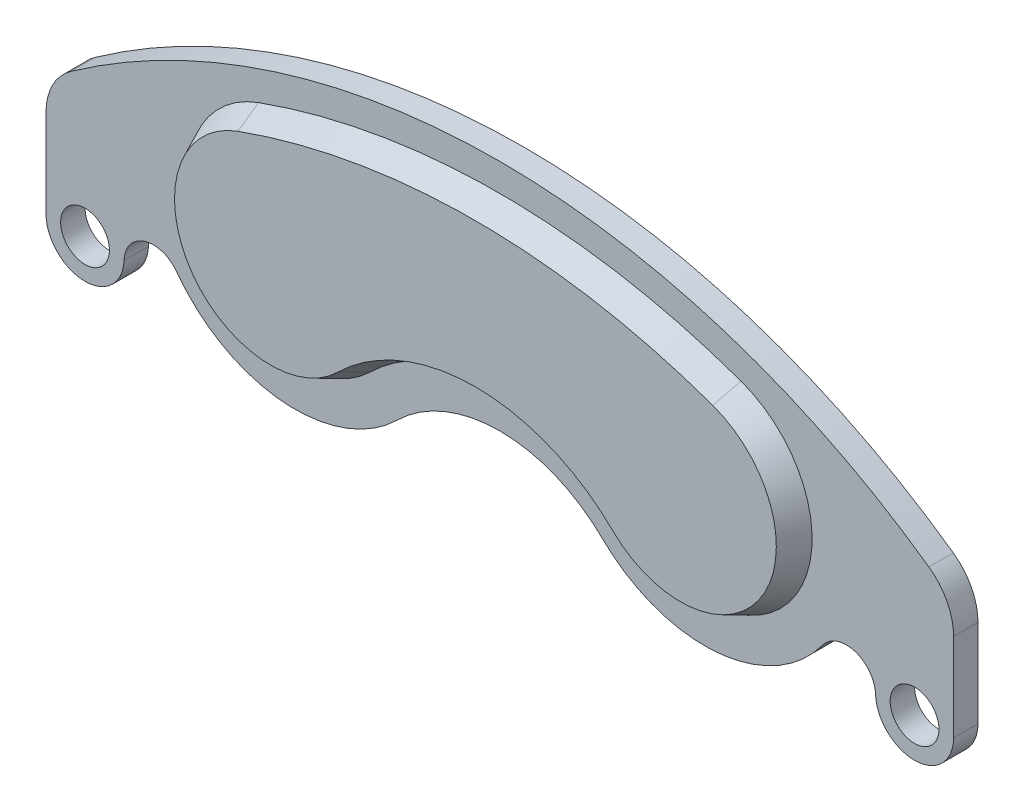
ISO-10303-21;
HEADER;
FILE_DESCRIPTION(('STEP AP214'),'2;1');
FILE_NAME('part.step','',(''),(''),'','','');
FILE_SCHEMA(('AUTOMOTIVE_DESIGN { 1 0 10303 214 1 1 1 1 }'));
ENDSEC;
DATA;
#1=APPLICATION_CONTEXT('core data for automotive mechanical design processes');
#2=APPLICATION_PROTOCOL_DEFINITION('international standard','automotive_design',2000,#1);
#3=PRODUCT_CONTEXT('',#1,'mechanical');
#4=PRODUCT('Part','Part','',(#3));
#5=PRODUCT_RELATED_PRODUCT_CATEGORY('part','',(#4));
#6=PRODUCT_DEFINITION_FORMATION('','',#4);
#7=PRODUCT_DEFINITION_CONTEXT('part definition',#1,'design');
#8=PRODUCT_DEFINITION('design','',#6,#7);
#9=PRODUCT_DEFINITION_SHAPE('','',#8);
#10=(LENGTH_UNIT() NAMED_UNIT(*) SI_UNIT(.MILLI.,.METRE.));
#11=(NAMED_UNIT(*) PLANE_ANGLE_UNIT() SI_UNIT($,.RADIAN.));
#12=(NAMED_UNIT(*) SI_UNIT($,.STERADIAN.) SOLID_ANGLE_UNIT());
#13=UNCERTAINTY_MEASURE_WITH_UNIT(LENGTH_MEASURE(1.E-05),#10,'distance_accuracy_value','');
#14=(GEOMETRIC_REPRESENTATION_CONTEXT(3) GLOBAL_UNCERTAINTY_ASSIGNED_CONTEXT((#13)) GLOBAL_UNIT_ASSIGNED_CONTEXT((#10,
#11,#12)) REPRESENTATION_CONTEXT('',''));
#15=CARTESIAN_POINT('',(0.,0.,0.));
#16=DIRECTION('',(0.,0.,1.));
#17=DIRECTION('',(1.,0.,0.));
#18=AXIS2_PLACEMENT_3D('',#15,#16,#17);
#19=CARTESIAN_POINT('',(-42.5,48.094220372994,2.5));
#20=DIRECTION('',(0.,0.,-1.));
#21=DIRECTION('',(-1.,0.,0.));
#22=AXIS2_PLACEMENT_3D('',#19,#20,#21);
#23=CYLINDRICAL_SURFACE('',#22,4.);
#24=CARTESIAN_POINT('',(-42.5,48.094220372994,0.));
#25=DIRECTION('',(0.,0.,1.));
#26=DIRECTION('',(1.,0.,0.));
#27=AXIS2_PLACEMENT_3D('',#24,#25,#26);
#28=CIRCLE('',#27,4.);
#29=CARTESIAN_POINT('',(-46.5,48.094220372994,0.));
#30=VERTEX_POINT('',#29);
#31=CARTESIAN_POINT('',(-38.5026206430965,47.9494506351267,0.));
#32=VERTEX_POINT('',#31);
#33=EDGE_CURVE('E187',#30,#32,#28,.T.);
#34=ORIENTED_EDGE('',*,*,#33,.T.);
#35=DIRECTION('',(0.,0.,-1.));
#36=VECTOR('',#35,1.);
#37=CARTESIAN_POINT('',(-38.5026206430965,47.9494506351267,2.5));
#38=LINE('',#37,#36);
#39=CARTESIAN_POINT('',(-38.5026206430965,47.9494506351267,2.5));
#40=VERTEX_POINT('',#39);
#41=EDGE_CURVE('E11',#40,#32,#38,.T.);
#42=ORIENTED_EDGE('',*,*,#41,.F.);
#43=CARTESIAN_POINT('',(-42.5,48.094220372994,2.5));
#44=DIRECTION('',(0.,0.,1.));
#45=DIRECTION('',(1.,0.,0.));
#46=AXIS2_PLACEMENT_3D('',#43,#44,#45);
#47=CIRCLE('',#46,4.);
#48=CARTESIAN_POINT('',(-46.5,48.094220372994,2.5));
#49=VERTEX_POINT('',#48);
#50=EDGE_CURVE('E223',#49,#40,#47,.T.);
#51=ORIENTED_EDGE('',*,*,#50,.F.);
#52=DIRECTION('',(0.,0.,-1.));
#53=VECTOR('',#52,1.);
#54=CARTESIAN_POINT('',(-46.5,48.094220372994,2.5));
#55=LINE('',#54,#53);
#56=EDGE_CURVE('E183',#49,#30,#55,.T.);
#57=ORIENTED_EDGE('',*,*,#56,.T.);
#58=EDGE_LOOP('',(#34,#42,#51,#57));
#59=FACE_BOUND('',#58,.T.);
#60=ADVANCED_FACE('F51',(#59),#23,.T.);
#61=CARTESIAN_POINT('',(-35.504586125419,47.8408733317263,2.5));
#62=DIRECTION('',(0.,0.,-1.));
#63=DIRECTION('',(-1.,0.,0.));
#64=AXIS2_PLACEMENT_3D('',#61,#62,#63);
#65=CYLINDRICAL_SURFACE('',#64,3.);
#66=CARTESIAN_POINT('',(-35.504586125419,47.8408733317263,0.));
#67=DIRECTION('',(0.,0.,-1.));
#68=DIRECTION('',(-1.,0.,0.));
#69=AXIS2_PLACEMENT_3D('',#66,#67,#68);
#70=CIRCLE('',#69,3.);
#71=CARTESIAN_POINT('',(-33.0871551045158,49.6173944431053,0.));
#72=VERTEX_POINT('',#71);
#73=EDGE_CURVE('E191',#32,#72,#70,.T.);
#74=ORIENTED_EDGE('',*,*,#73,.T.);
#75=DIRECTION('',(0.,0.,-1.));
#76=VECTOR('',#75,1.);
#77=CARTESIAN_POINT('',(-33.0871551045158,49.6173944431053,2.5));
#78=LINE('',#77,#76);
#79=CARTESIAN_POINT('',(-33.0871551045158,49.6173944431053,2.5));
#80=VERTEX_POINT('',#79);
#81=EDGE_CURVE('E59',#80,#72,#78,.T.);
#82=ORIENTED_EDGE('',*,*,#81,.F.);
#83=CARTESIAN_POINT('',(-35.504586125419,47.8408733317263,2.5));
#84=DIRECTION('',(0.,0.,-1.));
#85=DIRECTION('',(-1.,0.,0.));
#86=AXIS2_PLACEMENT_3D('',#83,#84,#85);
#87=CIRCLE('',#86,3.);
#88=EDGE_CURVE('E128',#40,#80,#87,.T.);
#89=ORIENTED_EDGE('',*,*,#88,.F.);
#90=ORIENTED_EDGE('',*,*,#41,.T.);
#91=EDGE_LOOP('',(#74,#82,#89,#90));
#92=FACE_BOUND('',#91,.T.);
#93=ADVANCED_FACE('F428',(#92),#65,.F.);
#94=CARTESIAN_POINT('',(-21.,58.5,2.5));
#95=DIRECTION('',(0.,0.,-1.));
#96=DIRECTION('',(-1.,0.,0.));
#97=AXIS2_PLACEMENT_3D('',#94,#95,#96);
#98=CYLINDRICAL_SURFACE('',#97,15.);
#99=CARTESIAN_POINT('',(-21.,58.5,0.));
#100=DIRECTION('',(0.,0.,1.));
#101=DIRECTION('',(1.,0.,0.));
#102=AXIS2_PLACEMENT_3D('',#99,#100,#101);
#103=CIRCLE('',#102,15.);
#104=CARTESIAN_POINT('',(-10.5,47.7878573571857,0.));
#105=VERTEX_POINT('',#104);
#106=EDGE_CURVE('E195',#72,#105,#103,.T.);
#107=ORIENTED_EDGE('',*,*,#106,.T.);
#108=DIRECTION('',(0.,0.,-1.));
#109=VECTOR('',#108,1.);
#110=CARTESIAN_POINT('',(-10.5,47.7878573571857,2.5));
#111=LINE('',#110,#109);
#112=CARTESIAN_POINT('',(-10.5,47.7878573571857,2.5));
#113=VERTEX_POINT('',#112);
#114=EDGE_CURVE('E250',#113,#105,#111,.T.);
#115=ORIENTED_EDGE('',*,*,#114,.F.);
#116=CARTESIAN_POINT('',(-21.,58.5,2.5));
#117=DIRECTION('',(0.,0.,1.));
#118=DIRECTION('',(1.,0.,0.));
#119=AXIS2_PLACEMENT_3D('',#116,#117,#118);
#120=CIRCLE('',#119,15.);
#121=EDGE_CURVE('E260',#80,#113,#120,.T.);
#122=ORIENTED_EDGE('',*,*,#121,.F.);
#123=ORIENTED_EDGE('',*,*,#81,.T.);
#124=EDGE_LOOP('',(#107,#115,#122,#123));
#125=FACE_BOUND('',#124,.T.);
#126=ADVANCED_FACE('F258',(#125),#98,.T.);
#127=CARTESIAN_POINT('',(0.,37.0757147143715,2.5));
#128=DIRECTION('',(0.,0.,-1.));
#129=DIRECTION('',(-1.,0.,0.));
#130=AXIS2_PLACEMENT_3D('',#127,#128,#129);
#131=CYLINDRICAL_SURFACE('',#130,15.);
#132=CARTESIAN_POINT('',(0.,37.0757147143715,0.));
#133=DIRECTION('',(0.,0.,-1.));
#134=DIRECTION('',(-1.,0.,0.));
#135=AXIS2_PLACEMENT_3D('',#132,#133,#134);
#136=CIRCLE('',#135,15.);
#137=CARTESIAN_POINT('',(10.5,47.7878573571857,0.));
#138=VERTEX_POINT('',#137);
#139=EDGE_CURVE('E198',#105,#138,#136,.T.);
#140=ORIENTED_EDGE('',*,*,#139,.T.);
#141=DIRECTION('',(0.,0.,-1.));
#142=VECTOR('',#141,1.);
#143=CARTESIAN_POINT('',(10.5,47.7878573571857,2.5));
#144=LINE('',#143,#142);
#145=CARTESIAN_POINT('',(10.5,47.7878573571857,2.5));
#146=VERTEX_POINT('',#145);
#147=EDGE_CURVE('E246',#146,#138,#144,.T.);
#148=ORIENTED_EDGE('',*,*,#147,.F.);
#149=CARTESIAN_POINT('',(0.,37.0757147143715,2.5));
#150=DIRECTION('',(0.,0.,-1.));
#151=DIRECTION('',(-1.,0.,0.));
#152=AXIS2_PLACEMENT_3D('',#149,#150,#151);
#153=CIRCLE('',#152,15.);
#154=EDGE_CURVE('E279',#113,#146,#153,.T.);
#155=ORIENTED_EDGE('',*,*,#154,.F.);
#156=ORIENTED_EDGE('',*,*,#114,.T.);
#157=EDGE_LOOP('',(#140,#148,#155,#156));
#158=FACE_BOUND('',#157,.T.);
#159=ADVANCED_FACE('F269',(#158),#131,.F.);
#160=CARTESIAN_POINT('',(21.,58.5,2.5));
#161=DIRECTION('',(0.,0.,-1.));
#162=DIRECTION('',(-1.,0.,0.));
#163=AXIS2_PLACEMENT_3D('',#160,#161,#162);
#164=CYLINDRICAL_SURFACE('',#163,15.);
#165=CARTESIAN_POINT('',(21.,58.5,0.));
#166=DIRECTION('',(0.,0.,1.));
#167=DIRECTION('',(-1.,0.,0.));
#168=AXIS2_PLACEMENT_3D('',#165,#166,#167);
#169=CIRCLE('',#168,15.);
#170=CARTESIAN_POINT('',(33.0871551045158,49.6173944431053,0.));
#171=VERTEX_POINT('',#170);
#172=EDGE_CURVE('E201',#138,#171,#169,.T.);
#173=ORIENTED_EDGE('',*,*,#172,.T.);
#174=DIRECTION('',(0.,0.,-1.));
#175=VECTOR('',#174,1.);
#176=CARTESIAN_POINT('',(33.0871551045158,49.6173944431053,2.5));
#177=LINE('',#176,#175);
#178=CARTESIAN_POINT('',(33.0871551045158,49.6173944431053,2.5));
#179=VERTEX_POINT('',#178);
#180=EDGE_CURVE('E242',#179,#171,#177,.T.);
#181=ORIENTED_EDGE('',*,*,#180,.F.);
#182=CARTESIAN_POINT('',(21.,58.5,2.5));
#183=DIRECTION('',(0.,0.,1.));
#184=DIRECTION('',(-1.,0.,0.));
#185=AXIS2_PLACEMENT_3D('',#182,#183,#184);
#186=CIRCLE('',#185,15.);
#187=EDGE_CURVE('E275',#146,#179,#186,.T.);
#188=ORIENTED_EDGE('',*,*,#187,.F.);
#189=ORIENTED_EDGE('',*,*,#147,.T.);
#190=EDGE_LOOP('',(#173,#181,#188,#189));
#191=FACE_BOUND('',#190,.T.);
#192=ADVANCED_FACE('F273',(#191),#164,.T.);
#193=CARTESIAN_POINT('',(35.504586125419,47.8408733317263,2.5));
#194=DIRECTION('',(0.,0.,-1.));
#195=DIRECTION('',(-1.,0.,0.));
#196=AXIS2_PLACEMENT_3D('',#193,#194,#195);
#197=CYLINDRICAL_SURFACE('',#196,3.);
#198=CARTESIAN_POINT('',(35.504586125419,47.8408733317263,0.));
#199=DIRECTION('',(0.,0.,-1.));
#200=DIRECTION('',(1.,0.,0.));
#201=AXIS2_PLACEMENT_3D('',#198,#199,#200);
#202=CIRCLE('',#201,3.);
#203=CARTESIAN_POINT('',(38.5026206430965,47.9494506351267,0.));
#204=VERTEX_POINT('',#203);
#205=EDGE_CURVE('E204',#171,#204,#202,.T.);
#206=ORIENTED_EDGE('',*,*,#205,.T.);
#207=DIRECTION('',(0.,0.,-1.));
#208=VECTOR('',#207,1.);
#209=CARTESIAN_POINT('',(38.5026206430965,47.9494506351267,2.5));
#210=LINE('',#209,#208);
#211=CARTESIAN_POINT('',(38.5026206430965,47.9494506351267,2.5));
#212=VERTEX_POINT('',#211);
#213=EDGE_CURVE('E238',#212,#204,#210,.T.);
#214=ORIENTED_EDGE('',*,*,#213,.F.);
#215=CARTESIAN_POINT('',(35.504586125419,47.8408733317263,2.5));
#216=DIRECTION('',(0.,0.,-1.));
#217=DIRECTION('',(1.,0.,0.));
#218=AXIS2_PLACEMENT_3D('',#215,#216,#217);
#219=CIRCLE('',#218,3.);
#220=EDGE_CURVE('E278',#179,#212,#219,.T.);
#221=ORIENTED_EDGE('',*,*,#220,.F.);
#222=ORIENTED_EDGE('',*,*,#180,.T.);
#223=EDGE_LOOP('',(#206,#214,#221,#222));
#224=FACE_BOUND('',#223,.T.);
#225=ADVANCED_FACE('F441',(#224),#197,.F.);
#226=CARTESIAN_POINT('',(42.5,48.094220372994,2.5));
#227=DIRECTION('',(0.,0.,-1.));
#228=DIRECTION('',(-1.,0.,0.));
#229=AXIS2_PLACEMENT_3D('',#226,#227,#228);
#230=CYLINDRICAL_SURFACE('',#229,4.);
#231=CARTESIAN_POINT('',(42.5,48.094220372994,0.));
#232=DIRECTION('',(0.,0.,1.));
#233=DIRECTION('',(-1.,0.,0.));
#234=AXIS2_PLACEMENT_3D('',#231,#232,#233);
#235=CIRCLE('',#234,4.);
#236=CARTESIAN_POINT('',(46.5,48.094220372994,0.));
#237=VERTEX_POINT('',#236);
#238=EDGE_CURVE('E207',#204,#237,#235,.T.);
#239=ORIENTED_EDGE('',*,*,#238,.T.);
#240=DIRECTION('',(0.,0.,-1.));
#241=VECTOR('',#240,1.);
#242=CARTESIAN_POINT('',(46.5,48.094220372994,2.5));
#243=LINE('',#242,#241);
#244=CARTESIAN_POINT('',(46.5,48.094220372994,2.5));
#245=VERTEX_POINT('',#244);
#246=EDGE_CURVE('E234',#245,#237,#243,.T.);
#247=ORIENTED_EDGE('',*,*,#246,.F.);
#248=CARTESIAN_POINT('',(42.5,48.094220372994,2.5));
#249=DIRECTION('',(0.,0.,1.));
#250=DIRECTION('',(-1.,0.,0.));
#251=AXIS2_PLACEMENT_3D('',#248,#249,#250);
#252=CIRCLE('',#251,4.);
#253=EDGE_CURVE('E283',#212,#245,#252,.T.);
#254=ORIENTED_EDGE('',*,*,#253,.F.);
#255=ORIENTED_EDGE('',*,*,#213,.T.);
#256=EDGE_LOOP('',(#239,#247,#254,#255));
#257=FACE_BOUND('',#256,.T.);
#258=ADVANCED_FACE('F444',(#257),#230,.T.);
#259=CARTESIAN_POINT('',(46.5,57.094220372994,2.5));
#260=DIRECTION('',(-1.,0.,0.));
#261=DIRECTION('',(0.,0.,1.));
#262=AXIS2_PLACEMENT_3D('',#259,#260,#261);
#263=PLANE('',#262);
#264=DIRECTION('',(0.,1.,0.));
#265=VECTOR('',#264,1.);
#266=CARTESIAN_POINT('',(46.5,57.094220372994,0.));
#267=LINE('',#266,#265);
#268=CARTESIAN_POINT('',(46.5,57.094220372994,0.));
#269=VERTEX_POINT('',#268);
#270=EDGE_CURVE('E210',#237,#269,#267,.T.);
#271=ORIENTED_EDGE('',*,*,#270,.T.);
#272=DIRECTION('',(0.,0.,-1.));
#273=VECTOR('',#272,1.);
#274=CARTESIAN_POINT('',(46.5,57.094220372994,2.5));
#275=LINE('',#274,#273);
#276=CARTESIAN_POINT('',(46.5,57.094220372994,2.5));
#277=VERTEX_POINT('',#276);
#278=EDGE_CURVE('E230',#277,#269,#275,.T.);
#279=ORIENTED_EDGE('',*,*,#278,.F.);
#280=DIRECTION('',(0.,1.,0.));
#281=VECTOR('',#280,1.);
#282=CARTESIAN_POINT('',(46.5,57.094220372994,2.5));
#283=LINE('',#282,#281);
#284=EDGE_CURVE('E290',#245,#277,#283,.T.);
#285=ORIENTED_EDGE('',*,*,#284,.F.);
#286=ORIENTED_EDGE('',*,*,#246,.T.);
#287=EDGE_LOOP('',(#271,#279,#285,#286));
#288=FACE_BOUND('',#287,.T.);
#289=ADVANCED_FACE('F298',(#288),#263,.F.);
#290=CARTESIAN_POINT('',(40.5,57.094220372994,2.5));
#291=DIRECTION('',(0.,0.,-1.));
#292=DIRECTION('',(-1.,0.,0.));
#293=AXIS2_PLACEMENT_3D('',#290,#291,#292);
#294=CYLINDRICAL_SURFACE('',#293,6.);
#295=CARTESIAN_POINT('',(40.5,57.094220372994,0.));
#296=DIRECTION('',(0.,0.,1.));
#297=DIRECTION('',(-1.,0.,0.));
#298=AXIS2_PLACEMENT_3D('',#295,#296,#297);
#299=CIRCLE('',#298,6.);
#300=CARTESIAN_POINT('',(43.9714285714286,61.9880106906792,0.));
#301=VERTEX_POINT('',#300);
#302=EDGE_CURVE('E213',#269,#301,#299,.T.);
#303=ORIENTED_EDGE('',*,*,#302,.T.);
#304=DIRECTION('',(0.,0.,-1.));
#305=VECTOR('',#304,1.);
#306=CARTESIAN_POINT('',(43.9714285714286,61.9880106906792,2.5));
#307=LINE('',#306,#305);
#308=CARTESIAN_POINT('',(43.9714285714286,61.9880106906792,2.5));
#309=VERTEX_POINT('',#308);
#310=EDGE_CURVE('E176',#309,#301,#307,.T.);
#311=ORIENTED_EDGE('',*,*,#310,.F.);
#312=CARTESIAN_POINT('',(40.5,57.094220372994,2.5));
#313=DIRECTION('',(0.,0.,1.));
#314=DIRECTION('',(-1.,0.,0.));
#315=AXIS2_PLACEMENT_3D('',#312,#313,#314);
#316=CIRCLE('',#315,6.);
#317=EDGE_CURVE('E162',#277,#309,#316,.T.);
#318=ORIENTED_EDGE('',*,*,#317,.F.);
#319=ORIENTED_EDGE('',*,*,#278,.T.);
#320=EDGE_LOOP('',(#303,#311,#318,#319));
#321=FACE_BOUND('',#320,.T.);
#322=ADVANCED_FACE('F302',(#321),#294,.T.);
#323=CARTESIAN_POINT('',(0.,0.,2.5));
#324=DIRECTION('',(0.,0.,-1.));
#325=DIRECTION('',(-1.,0.,0.));
#326=AXIS2_PLACEMENT_3D('',#323,#324,#325);
#327=CYLINDRICAL_SURFACE('',#326,76.);
#328=CARTESIAN_POINT('',(0.,0.,0.));
#329=DIRECTION('',(0.,0.,1.));
#330=DIRECTION('',(1.,0.,0.));
#331=AXIS2_PLACEMENT_3D('',#328,#329,#330);
#332=CIRCLE('',#331,76.);
#333=CARTESIAN_POINT('',(-43.9714285714286,61.9880106906792,0.));
#334=VERTEX_POINT('',#333);
#335=EDGE_CURVE('E172',#301,#334,#332,.T.);
#336=ORIENTED_EDGE('',*,*,#335,.T.);
#337=DIRECTION('',(0.,0.,-1.));
#338=VECTOR('',#337,1.);
#339=CARTESIAN_POINT('',(-43.9714285714286,61.9880106906792,2.5));
#340=LINE('',#339,#338);
#341=CARTESIAN_POINT('',(-43.9714285714286,61.9880106906792,2.5));
#342=VERTEX_POINT('',#341);
#343=EDGE_CURVE('E169',#342,#334,#340,.T.);
#344=ORIENTED_EDGE('',*,*,#343,.F.);
#345=CARTESIAN_POINT('',(0.,0.,2.5));
#346=DIRECTION('',(0.,0.,1.));
#347=DIRECTION('',(1.,0.,0.));
#348=AXIS2_PLACEMENT_3D('',#345,#346,#347);
#349=CIRCLE('',#348,76.);
#350=EDGE_CURVE('E155',#309,#342,#349,.T.);
#351=ORIENTED_EDGE('',*,*,#350,.F.);
#352=ORIENTED_EDGE('',*,*,#310,.T.);
#353=EDGE_LOOP('',(#336,#344,#351,#352));
#354=FACE_BOUND('',#353,.T.);
#355=ADVANCED_FACE('F170',(#354),#327,.T.);
#356=CARTESIAN_POINT('',(-40.5,57.094220372994,2.5));
#357=DIRECTION('',(0.,0.,-1.));
#358=DIRECTION('',(-1.,0.,0.));
#359=AXIS2_PLACEMENT_3D('',#356,#357,#358);
#360=CYLINDRICAL_SURFACE('',#359,6.);
#361=CARTESIAN_POINT('',(-40.5,57.094220372994,0.));
#362=DIRECTION('',(0.,0.,1.));
#363=DIRECTION('',(1.,0.,0.));
#364=AXIS2_PLACEMENT_3D('',#361,#362,#363);
#365=CIRCLE('',#364,6.);
#366=CARTESIAN_POINT('',(-46.5,57.094220372994,0.));
#367=VERTEX_POINT('',#366);
#368=EDGE_CURVE('E218',#334,#367,#365,.T.);
#369=ORIENTED_EDGE('',*,*,#368,.T.);
#370=DIRECTION('',(0.,0.,-1.));
#371=VECTOR('',#370,1.);
#372=CARTESIAN_POINT('',(-46.5,57.094220372994,2.5));
#373=LINE('',#372,#371);
#374=CARTESIAN_POINT('',(-46.5,57.094220372994,2.5));
#375=VERTEX_POINT('',#374);
#376=EDGE_CURVE('E177',#375,#367,#373,.T.);
#377=ORIENTED_EDGE('',*,*,#376,.F.);
#378=CARTESIAN_POINT('',(-40.5,57.094220372994,2.5));
#379=DIRECTION('',(0.,0.,1.));
#380=DIRECTION('',(1.,0.,0.));
#381=AXIS2_PLACEMENT_3D('',#378,#379,#380);
#382=CIRCLE('',#381,6.);
#383=EDGE_CURVE('E159',#342,#375,#382,.T.);
#384=ORIENTED_EDGE('',*,*,#383,.F.);
#385=ORIENTED_EDGE('',*,*,#343,.T.);
#386=EDGE_LOOP('',(#369,#377,#384,#385));
#387=FACE_BOUND('',#386,.T.);
#388=ADVANCED_FACE('F179',(#387),#360,.T.);
#389=CARTESIAN_POINT('',(-46.5,57.094220372994,2.5));
#390=DIRECTION('',(1.,0.,0.));
#391=DIRECTION('',(0.,0.,-1.));
#392=AXIS2_PLACEMENT_3D('',#389,#390,#391);
#393=PLANE('',#392);
#394=DIRECTION('',(0.,-1.,0.));
#395=VECTOR('',#394,1.);
#396=CARTESIAN_POINT('',(-46.5,57.094220372994,0.));
#397=LINE('',#396,#395);
#398=EDGE_CURVE('E120',#367,#30,#397,.T.);
#399=ORIENTED_EDGE('',*,*,#398,.T.);
#400=ORIENTED_EDGE('',*,*,#56,.F.);
#401=DIRECTION('',(0.,-1.,0.));
#402=VECTOR('',#401,1.);
#403=CARTESIAN_POINT('',(-46.5,57.094220372994,2.5));
#404=LINE('',#403,#402);
#405=EDGE_CURVE('E75',#375,#49,#404,.T.);
#406=ORIENTED_EDGE('',*,*,#405,.F.);
#407=ORIENTED_EDGE('',*,*,#376,.T.);
#408=EDGE_LOOP('',(#399,#400,#406,#407));
#409=FACE_BOUND('',#408,.T.);
#410=ADVANCED_FACE('F303',(#409),#393,.F.);
#411=CARTESIAN_POINT('',(-42.5,48.094220372994,2.5));
#412=DIRECTION('',(0.,0.,1.));
#413=DIRECTION('',(1.,0.,0.));
#414=AXIS2_PLACEMENT_3D('',#411,#412,#413);
#415=PLANE('',#414);
#416=CARTESIAN_POINT('',(-42.5,48.094220372994,2.5));
#417=DIRECTION('',(0.,0.,1.));
#418=DIRECTION('',(1.,0.,0.));
#419=AXIS2_PLACEMENT_3D('',#416,#417,#418);
#420=CIRCLE('',#419,2.5);
#421=CARTESIAN_POINT('',(-40.,48.094220372994,2.5));
#422=VERTEX_POINT('',#421);
#423=EDGE_CURVE('E365',#422,#422,#420,.T.);
#424=ORIENTED_EDGE('',*,*,#423,.F.);
#425=EDGE_LOOP('',(#424));
#426=FACE_BOUND('',#425,.T.);
#427=CARTESIAN_POINT('',(42.5,48.094220372994,2.5));
#428=DIRECTION('',(0.,0.,1.));
#429=DIRECTION('',(1.,0.,0.));
#430=AXIS2_PLACEMENT_3D('',#427,#428,#429);
#431=CIRCLE('',#430,2.5);
#432=CARTESIAN_POINT('',(45.,48.094220372994,2.5));
#433=VERTEX_POINT('',#432);
#434=EDGE_CURVE('E357',#433,#433,#431,.T.);
#435=ORIENTED_EDGE('',*,*,#434,.F.);
#436=EDGE_LOOP('',(#435));
#437=FACE_BOUND('',#436,.T.);
#438=CARTESIAN_POINT('',(0.,37.0757147143715,2.5));
#439=DIRECTION('',(0.,0.,-1.));
#440=DIRECTION('',(1.,0.,0.));
#441=AXIS2_PLACEMENT_3D('',#438,#439,#440);
#442=CIRCLE('',#441,19.);
#443=CARTESIAN_POINT('',(-13.3,50.6444287286029,2.5));
#444=VERTEX_POINT('',#443);
#445=CARTESIAN_POINT('',(13.3,50.6444287286029,2.5));
#446=VERTEX_POINT('',#445);
#447=EDGE_CURVE('E348',#444,#446,#442,.T.);
#448=ORIENTED_EDGE('',*,*,#447,.F.);
#449=CARTESIAN_POINT('',(-21.,58.5,2.5));
#450=DIRECTION('',(0.,0.,1.));
#451=DIRECTION('',(1.,0.,0.));
#452=AXIS2_PLACEMENT_3D('',#449,#450,#451);
#453=CIRCLE('',#452,11.);
#454=CARTESIAN_POINT('',(-24.7165122896744,68.8531413783788,2.5));
#455=VERTEX_POINT('',#454);
#456=EDGE_CURVE('E352',#455,#444,#453,.T.);
#457=ORIENTED_EDGE('',*,*,#456,.F.);
#458=CARTESIAN_POINT('',(0.,0.,2.5));
#459=DIRECTION('',(0.,0.,1.));
#460=DIRECTION('',(1.,0.,0.));
#461=AXIS2_PLACEMENT_3D('',#458,#459,#460);
#462=CIRCLE('',#461,73.155048065302);
#463=CARTESIAN_POINT('',(24.7165122896744,68.8531413783788,2.5));
#464=VERTEX_POINT('',#463);
#465=EDGE_CURVE('E330',#464,#455,#462,.T.);
#466=ORIENTED_EDGE('',*,*,#465,.F.);
#467=CARTESIAN_POINT('',(21.,58.5,2.5));
#468=DIRECTION('',(0.,0.,1.));
#469=DIRECTION('',(1.,0.,0.));
#470=AXIS2_PLACEMENT_3D('',#467,#468,#469);
#471=CIRCLE('',#470,11.);
#472=EDGE_CURVE('E345',#446,#464,#471,.T.);
#473=ORIENTED_EDGE('',*,*,#472,.F.);
#474=EDGE_LOOP('',(#448,#457,#466,#473));
#475=FACE_BOUND('',#474,.T.);
#476=ORIENTED_EDGE('',*,*,#50,.T.);
#477=ORIENTED_EDGE('',*,*,#88,.T.);
#478=ORIENTED_EDGE('',*,*,#121,.T.);
#479=ORIENTED_EDGE('',*,*,#154,.T.);
#480=ORIENTED_EDGE('',*,*,#187,.T.);
#481=ORIENTED_EDGE('',*,*,#220,.T.);
#482=ORIENTED_EDGE('',*,*,#253,.T.);
#483=ORIENTED_EDGE('',*,*,#284,.T.);
#484=ORIENTED_EDGE('',*,*,#317,.T.);
#485=ORIENTED_EDGE('',*,*,#350,.T.);
#486=ORIENTED_EDGE('',*,*,#383,.T.);
#487=ORIENTED_EDGE('',*,*,#405,.T.);
#488=EDGE_LOOP('',(#476,#477,#478,#479,#480,#481,#482,#483,#484,#485,#486,#487));
#489=FACE_BOUND('',#488,.T.);
#490=ADVANCED_FACE('F157',(#426,#437,#475,#489),#415,.T.);
#491=CARTESIAN_POINT('',(-42.5,48.094220372994,0.));
#492=DIRECTION('',(0.,0.,1.));
#493=DIRECTION('',(1.,0.,0.));
#494=AXIS2_PLACEMENT_3D('',#491,#492,#493);
#495=PLANE('',#494);
#496=CARTESIAN_POINT('',(-42.5,48.094220372994,0.));
#497=DIRECTION('',(0.,0.,1.));
#498=DIRECTION('',(1.,0.,0.));
#499=AXIS2_PLACEMENT_3D('',#496,#497,#498);
#500=CIRCLE('',#499,2.5);
#501=CARTESIAN_POINT('',(-40.,48.094220372994,0.));
#502=VERTEX_POINT('',#501);
#503=EDGE_CURVE('E356',#502,#502,#500,.T.);
#504=ORIENTED_EDGE('',*,*,#503,.T.);
#505=EDGE_LOOP('',(#504));
#506=FACE_BOUND('',#505,.T.);
#507=CARTESIAN_POINT('',(42.5,48.094220372994,0.));
#508=DIRECTION('',(0.,0.,1.));
#509=DIRECTION('',(1.,0.,0.));
#510=AXIS2_PLACEMENT_3D('',#507,#508,#509);
#511=CIRCLE('',#510,2.5);
#512=CARTESIAN_POINT('',(45.,48.094220372994,0.));
#513=VERTEX_POINT('',#512);
#514=EDGE_CURVE('E361',#513,#513,#511,.T.);
#515=ORIENTED_EDGE('',*,*,#514,.T.);
#516=EDGE_LOOP('',(#515));
#517=FACE_BOUND('',#516,.T.);
#518=ORIENTED_EDGE('',*,*,#33,.F.);
#519=ORIENTED_EDGE('',*,*,#398,.F.);
#520=ORIENTED_EDGE('',*,*,#368,.F.);
#521=ORIENTED_EDGE('',*,*,#335,.F.);
#522=ORIENTED_EDGE('',*,*,#302,.F.);
#523=ORIENTED_EDGE('',*,*,#270,.F.);
#524=ORIENTED_EDGE('',*,*,#238,.F.);
#525=ORIENTED_EDGE('',*,*,#205,.F.);
#526=ORIENTED_EDGE('',*,*,#172,.F.);
#527=ORIENTED_EDGE('',*,*,#139,.F.);
#528=ORIENTED_EDGE('',*,*,#106,.F.);
#529=ORIENTED_EDGE('',*,*,#73,.F.);
#530=EDGE_LOOP('',(#518,#519,#520,#521,#522,#523,#524,#525,#526,#527,#528,#529));
#531=FACE_BOUND('',#530,.T.);
#532=ADVANCED_FACE('F264',(#506,#517,#531),#495,.F.);
#533=CARTESIAN_POINT('',(-21.,58.5,2.5));
#534=DIRECTION('',(0.,0.,-1.));
#535=DIRECTION('',(1.,0.,0.));
#536=AXIS2_PLACEMENT_3D('',#533,#534,#535);
#537=CONICAL_SURFACE('',#536,11.,0.436332312998583);
#538=ORIENTED_EDGE('',*,*,#456,.T.);
#539=DIRECTION('',(0.29583278321849,-0.30180980688164,-0.90630778703665));
#540=VECTOR('',#539,1.);
#541=CARTESIAN_POINT('',(-13.3,50.6444287286029,2.5));
#542=LINE('',#541,#540);
#543=CARTESIAN_POINT('',(-14.1160384017713,51.4769544202017,5.));
#544=VERTEX_POINT('',#543);
#545=EDGE_CURVE('E192',#544,#444,#542,.T.);
#546=ORIENTED_EDGE('',*,*,#545,.F.);
#547=CARTESIAN_POINT('',(-21.,58.5,5.));
#548=DIRECTION('',(0.,0.,1.));
#549=DIRECTION('',(1.,0.,0.));
#550=AXIS2_PLACEMENT_3D('',#547,#548,#549);
#551=CIRCLE('',#550,9.83423085461249);
#552=CARTESIAN_POINT('',(-24.3226399846057,67.7559256714016,5.));
#553=VERTEX_POINT('',#552);
#554=EDGE_CURVE('E326',#553,#544,#551,.T.);
#555=ORIENTED_EDGE('',*,*,#554,.F.);
#556=DIRECTION('',(-0.142787814872742,0.397766055716923,-0.90630778703665));
#557=VECTOR('',#556,1.);
#558=CARTESIAN_POINT('',(-24.7165122896744,68.8531413783788,2.5));
#559=LINE('',#558,#557);
#560=EDGE_CURVE('E317',#553,#455,#559,.T.);
#561=ORIENTED_EDGE('',*,*,#560,.T.);
#562=EDGE_LOOP('',(#538,#546,#555,#561));
#563=FACE_BOUND('',#562,.T.);
#564=ADVANCED_FACE('F416',(#563),#537,.T.);
#565=CARTESIAN_POINT('',(0.,37.0757147143715,2.5));
#566=DIRECTION('',(0.,0.,1.));
#567=DIRECTION('',(1.,0.,0.));
#568=AXIS2_PLACEMENT_3D('',#565,#566,#567);
#569=CONICAL_SURFACE('',#568,19.,0.436332312998583);
#570=ORIENTED_EDGE('',*,*,#447,.T.);
#571=DIRECTION('',(-0.29583278321849,-0.30180980688164,-0.90630778703665));
#572=VECTOR('',#571,1.);
#573=CARTESIAN_POINT('',(13.3,50.6444287286029,2.5));
#574=LINE('',#573,#572);
#575=CARTESIAN_POINT('',(14.1160384017713,51.4769544202017,5.));
#576=VERTEX_POINT('',#575);
#577=EDGE_CURVE('E331',#576,#446,#574,.T.);
#578=ORIENTED_EDGE('',*,*,#577,.F.);
#579=CARTESIAN_POINT('',(0.,37.0757147143715,5.));
#580=DIRECTION('',(0.,0.,1.));
#581=DIRECTION('',(1.,0.,0.));
#582=AXIS2_PLACEMENT_3D('',#579,#580,#581);
#583=CIRCLE('',#582,20.1657691453875);
#584=EDGE_CURVE('E322',#544,#576,#583,.F.);
#585=ORIENTED_EDGE('',*,*,#584,.F.);
#586=ORIENTED_EDGE('',*,*,#545,.T.);
#587=EDGE_LOOP('',(#570,#578,#585,#586));
#588=FACE_BOUND('',#587,.T.);
#589=ADVANCED_FACE('F397',(#588),#569,.F.);
#590=CARTESIAN_POINT('',(21.,58.5,2.5));
#591=DIRECTION('',(0.,0.,-1.));
#592=DIRECTION('',(1.,0.,0.));
#593=AXIS2_PLACEMENT_3D('',#590,#591,#592);
#594=CONICAL_SURFACE('',#593,11.,0.436332312998583);
#595=ORIENTED_EDGE('',*,*,#472,.T.);
#596=DIRECTION('',(0.142787814872742,0.397766055716924,-0.90630778703665));
#597=VECTOR('',#596,1.);
#598=CARTESIAN_POINT('',(24.7165122896744,68.8531413783788,2.5));
#599=LINE('',#598,#597);
#600=CARTESIAN_POINT('',(24.3226399846057,67.7559256714017,5.));
#601=VERTEX_POINT('',#600);
#602=EDGE_CURVE('E66',#601,#464,#599,.T.);
#603=ORIENTED_EDGE('',*,*,#602,.F.);
#604=CARTESIAN_POINT('',(21.,58.5,5.));
#605=DIRECTION('',(0.,0.,1.));
#606=DIRECTION('',(1.,0.,0.));
#607=AXIS2_PLACEMENT_3D('',#604,#605,#606);
#608=CIRCLE('',#607,9.8342308546125);
#609=EDGE_CURVE('E318',#576,#601,#608,.T.);
#610=ORIENTED_EDGE('',*,*,#609,.F.);
#611=ORIENTED_EDGE('',*,*,#577,.T.);
#612=EDGE_LOOP('',(#595,#603,#610,#611));
#613=FACE_BOUND('',#612,.T.);
#614=ADVANCED_FACE('F404',(#613),#594,.T.);
#615=CARTESIAN_POINT('',(0.,0.,2.5));
#616=DIRECTION('',(0.,0.,-1.));
#617=DIRECTION('',(1.,0.,0.));
#618=AXIS2_PLACEMENT_3D('',#615,#616,#617);
#619=CONICAL_SURFACE('',#618,73.155048065302,0.436332312998583);
#620=ORIENTED_EDGE('',*,*,#465,.T.);
#621=ORIENTED_EDGE('',*,*,#560,.F.);
#622=CARTESIAN_POINT('',(0.,0.,5.));
#623=DIRECTION('',(0.,0.,1.));
#624=DIRECTION('',(1.,0.,0.));
#625=AXIS2_PLACEMENT_3D('',#622,#623,#624);
#626=CIRCLE('',#625,71.9892789199145);
#627=EDGE_CURVE('E312',#601,#553,#626,.T.);
#628=ORIENTED_EDGE('',*,*,#627,.F.);
#629=ORIENTED_EDGE('',*,*,#602,.T.);
#630=EDGE_LOOP('',(#620,#621,#628,#629));
#631=FACE_BOUND('',#630,.T.);
#632=ADVANCED_FACE('F413',(#631),#619,.T.);
#633=CARTESIAN_POINT('',(-10.5,47.7878573571857,5.));
#634=DIRECTION('',(0.,0.,1.));
#635=DIRECTION('',(1.,0.,0.));
#636=AXIS2_PLACEMENT_3D('',#633,#634,#635);
#637=PLANE('',#636);
#638=ORIENTED_EDGE('',*,*,#554,.T.);
#639=ORIENTED_EDGE('',*,*,#584,.T.);
#640=ORIENTED_EDGE('',*,*,#609,.T.);
#641=ORIENTED_EDGE('',*,*,#627,.T.);
#642=EDGE_LOOP('',(#638,#639,#640,#641));
#643=FACE_BOUND('',#642,.T.);
#644=ADVANCED_FACE('F409',(#643),#637,.T.);
#645=CARTESIAN_POINT('',(42.5,48.094220372994,0.));
#646=DIRECTION('',(0.,0.,1.));
#647=DIRECTION('',(1.,0.,0.));
#648=AXIS2_PLACEMENT_3D('',#645,#646,#647);
#649=CYLINDRICAL_SURFACE('',#648,2.5);
#650=ORIENTED_EDGE('',*,*,#514,.F.);
#651=EDGE_LOOP('',(#650));
#652=FACE_BOUND('',#651,.T.);
#653=ORIENTED_EDGE('',*,*,#434,.T.);
#654=EDGE_LOOP('',(#653));
#655=FACE_BOUND('',#654,.T.);
#656=ADVANCED_FACE('F378',(#652,#655),#649,.F.);
#657=CARTESIAN_POINT('',(-42.5,48.094220372994,0.));
#658=DIRECTION('',(0.,0.,1.));
#659=DIRECTION('',(1.,0.,0.));
#660=AXIS2_PLACEMENT_3D('',#657,#658,#659);
#661=CYLINDRICAL_SURFACE('',#660,2.5);
#662=ORIENTED_EDGE('',*,*,#503,.F.);
#663=EDGE_LOOP('',(#662));
#664=FACE_BOUND('',#663,.T.);
#665=ORIENTED_EDGE('',*,*,#423,.T.);
#666=EDGE_LOOP('',(#665));
#667=FACE_BOUND('',#666,.T.);
#668=ADVANCED_FACE('F375',(#664,#667),#661,.F.);
#669=CLOSED_SHELL('',(#60,#93,#126,#159,#192,#225,#258,#289,#322,#355,#388,#410,#490,#532,#564,
#589,#614,#632,#644,#656,#668));
#670=MANIFOLD_SOLID_BREP('B2',#669);
#671=ADVANCED_BREP_SHAPE_REPRESENTATION('',(#18,#670),#14);
#672=SHAPE_DEFINITION_REPRESENTATION(#9,#671);
ENDSEC;
END-ISO-10303-21;
